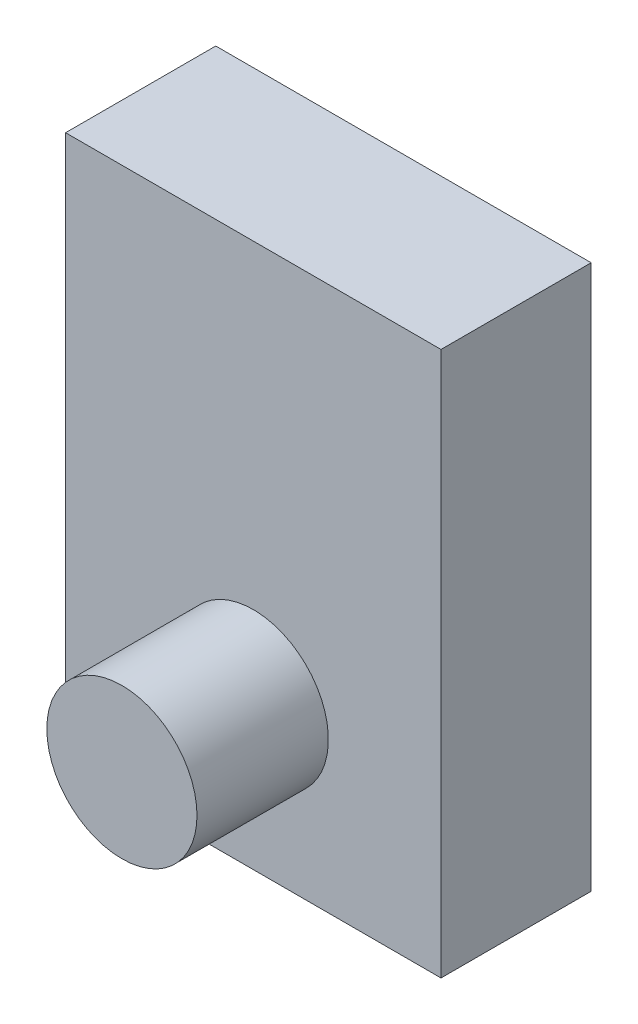
ISO-10303-21;
HEADER;
FILE_DESCRIPTION(('STEP AP214'),'2;1');
FILE_NAME('part.step','',(''),(''),'','','');
FILE_SCHEMA(('AUTOMOTIVE_DESIGN { 1 0 10303 214 1 1 1 1 }'));
ENDSEC;
DATA;
#1=APPLICATION_CONTEXT('core data for automotive mechanical design processes');
#2=APPLICATION_PROTOCOL_DEFINITION('international standard','automotive_design',2000,#1);
#3=PRODUCT_CONTEXT('',#1,'mechanical');
#4=PRODUCT('Part','Part','',(#3));
#5=PRODUCT_RELATED_PRODUCT_CATEGORY('part','',(#4));
#6=PRODUCT_DEFINITION_FORMATION('','',#4);
#7=PRODUCT_DEFINITION_CONTEXT('part definition',#1,'design');
#8=PRODUCT_DEFINITION('design','',#6,#7);
#9=PRODUCT_DEFINITION_SHAPE('','',#8);
#10=(LENGTH_UNIT() NAMED_UNIT(*) SI_UNIT(.MILLI.,.METRE.));
#11=(NAMED_UNIT(*) PLANE_ANGLE_UNIT() SI_UNIT($,.RADIAN.));
#12=(NAMED_UNIT(*) SI_UNIT($,.STERADIAN.) SOLID_ANGLE_UNIT());
#13=UNCERTAINTY_MEASURE_WITH_UNIT(LENGTH_MEASURE(1.E-05),#10,'distance_accuracy_value','');
#14=(GEOMETRIC_REPRESENTATION_CONTEXT(3) GLOBAL_UNCERTAINTY_ASSIGNED_CONTEXT((#13)) GLOBAL_UNIT_ASSIGNED_CONTEXT((#10,
#11,#12)) REPRESENTATION_CONTEXT('',''));
#15=CARTESIAN_POINT('',(0.,0.,0.));
#16=DIRECTION('',(0.,0.,1.));
#17=DIRECTION('',(1.,0.,0.));
#18=AXIS2_PLACEMENT_3D('',#15,#16,#17);
#19=CARTESIAN_POINT('',(-10.,29.,-6.5));
#20=DIRECTION('',(1.,0.,0.));
#21=DIRECTION('',(0.,0.,-1.));
#22=AXIS2_PLACEMENT_3D('',#19,#20,#21);
#23=PLANE('',#22);
#24=DIRECTION('',(0.,0.,1.));
#25=VECTOR('',#24,1.);
#26=CARTESIAN_POINT('',(-10.,0.,-6.5));
#27=LINE('',#26,#25);
#28=CARTESIAN_POINT('',(-10.,0.,-6.5));
#29=VERTEX_POINT('',#28);
#30=CARTESIAN_POINT('',(-10.,0.,1.5));
#31=VERTEX_POINT('',#30);
#32=EDGE_CURVE('E112',#29,#31,#27,.T.);
#33=ORIENTED_EDGE('',*,*,#32,.T.);
#34=DIRECTION('',(0.,-1.,0.));
#35=VECTOR('',#34,1.);
#36=CARTESIAN_POINT('',(-10.,29.,1.5));
#37=LINE('',#36,#35);
#38=CARTESIAN_POINT('',(-10.,29.,1.5));
#39=VERTEX_POINT('',#38);
#40=EDGE_CURVE('E105',#39,#31,#37,.T.);
#41=ORIENTED_EDGE('',*,*,#40,.F.);
#42=DIRECTION('',(0.,0.,1.));
#43=VECTOR('',#42,1.);
#44=CARTESIAN_POINT('',(-10.,29.,-6.5));
#45=LINE('',#44,#43);
#46=CARTESIAN_POINT('',(-10.,29.,-6.5));
#47=VERTEX_POINT('',#46);
#48=EDGE_CURVE('E96',#47,#39,#45,.T.);
#49=ORIENTED_EDGE('',*,*,#48,.F.);
#50=DIRECTION('',(0.,-1.,0.));
#51=VECTOR('',#50,1.);
#52=CARTESIAN_POINT('',(-10.,29.,-6.5));
#53=LINE('',#52,#51);
#54=EDGE_CURVE('E110',#47,#29,#53,.T.);
#55=ORIENTED_EDGE('',*,*,#54,.T.);
#56=EDGE_LOOP('',(#33,#41,#49,#55));
#57=FACE_BOUND('',#56,.T.);
#58=ADVANCED_FACE('F43',(#57),#23,.F.);
#59=CARTESIAN_POINT('',(-10.,29.,1.5));
#60=DIRECTION('',(0.,0.,-1.));
#61=DIRECTION('',(-1.,0.,0.));
#62=AXIS2_PLACEMENT_3D('',#59,#60,#61);
#63=PLANE('',#62);
#64=CARTESIAN_POINT('',(0.,8.,1.5));
#65=DIRECTION('',(0.,0.,-1.));
#66=DIRECTION('',(-1.,0.,0.));
#67=AXIS2_PLACEMENT_3D('',#64,#65,#66);
#68=CIRCLE('',#67,4.);
#69=CARTESIAN_POINT('',(-4.,8.,1.5));
#70=VERTEX_POINT('',#69);
#71=EDGE_CURVE('E11',#70,#70,#68,.F.);
#72=ORIENTED_EDGE('',*,*,#71,.F.);
#73=EDGE_LOOP('',(#72));
#74=FACE_BOUND('',#73,.T.);
#75=DIRECTION('',(1.,0.,0.));
#76=VECTOR('',#75,1.);
#77=CARTESIAN_POINT('',(-10.,0.,1.5));
#78=LINE('',#77,#76);
#79=CARTESIAN_POINT('',(10.,0.,1.5));
#80=VERTEX_POINT('',#79);
#81=EDGE_CURVE('E101',#31,#80,#78,.T.);
#82=ORIENTED_EDGE('',*,*,#81,.T.);
#83=DIRECTION('',(0.,-1.,0.));
#84=VECTOR('',#83,1.);
#85=CARTESIAN_POINT('',(10.,29.,1.5));
#86=LINE('',#85,#84);
#87=CARTESIAN_POINT('',(10.,29.,1.5));
#88=VERTEX_POINT('',#87);
#89=EDGE_CURVE('E97',#88,#80,#86,.T.);
#90=ORIENTED_EDGE('',*,*,#89,.F.);
#91=DIRECTION('',(1.,0.,0.));
#92=VECTOR('',#91,1.);
#93=CARTESIAN_POINT('',(-10.,29.,1.5));
#94=LINE('',#93,#92);
#95=EDGE_CURVE('E93',#39,#88,#94,.T.);
#96=ORIENTED_EDGE('',*,*,#95,.F.);
#97=ORIENTED_EDGE('',*,*,#40,.T.);
#98=EDGE_LOOP('',(#82,#90,#96,#97));
#99=FACE_BOUND('',#98,.T.);
#100=ADVANCED_FACE('F99',(#74,#99),#63,.F.);
#101=CARTESIAN_POINT('',(10.,29.,1.5));
#102=DIRECTION('',(-1.,0.,0.));
#103=DIRECTION('',(0.,0.,1.));
#104=AXIS2_PLACEMENT_3D('',#101,#102,#103);
#105=PLANE('',#104);
#106=DIRECTION('',(0.,0.,-1.));
#107=VECTOR('',#106,1.);
#108=CARTESIAN_POINT('',(10.,0.,1.5));
#109=LINE('',#108,#107);
#110=CARTESIAN_POINT('',(10.,0.,-6.5));
#111=VERTEX_POINT('',#110);
#112=EDGE_CURVE('E80',#80,#111,#109,.T.);
#113=ORIENTED_EDGE('',*,*,#112,.T.);
#114=DIRECTION('',(0.,-1.,0.));
#115=VECTOR('',#114,1.);
#116=CARTESIAN_POINT('',(10.,29.,-6.5));
#117=LINE('',#116,#115);
#118=CARTESIAN_POINT('',(10.,29.,-6.5));
#119=VERTEX_POINT('',#118);
#120=EDGE_CURVE('E103',#119,#111,#117,.T.);
#121=ORIENTED_EDGE('',*,*,#120,.F.);
#122=DIRECTION('',(0.,0.,-1.));
#123=VECTOR('',#122,1.);
#124=CARTESIAN_POINT('',(10.,29.,1.5));
#125=LINE('',#124,#123);
#126=EDGE_CURVE('E94',#88,#119,#125,.T.);
#127=ORIENTED_EDGE('',*,*,#126,.F.);
#128=ORIENTED_EDGE('',*,*,#89,.T.);
#129=EDGE_LOOP('',(#113,#121,#127,#128));
#130=FACE_BOUND('',#129,.T.);
#131=ADVANCED_FACE('F104',(#130),#105,.F.);
#132=CARTESIAN_POINT('',(10.,29.,-6.5));
#133=DIRECTION('',(0.,0.,1.));
#134=DIRECTION('',(1.,0.,0.));
#135=AXIS2_PLACEMENT_3D('',#132,#133,#134);
#136=PLANE('',#135);
#137=CARTESIAN_POINT('',(0.,8.,-6.5));
#138=DIRECTION('',(0.,0.,1.));
#139=DIRECTION('',(1.,0.,0.));
#140=AXIS2_PLACEMENT_3D('',#137,#138,#139);
#141=CIRCLE('',#140,4.);
#142=CARTESIAN_POINT('',(4.,8.,-6.5));
#143=VERTEX_POINT('',#142);
#144=EDGE_CURVE('E46',#143,#143,#141,.F.);
#145=ORIENTED_EDGE('',*,*,#144,.F.);
#146=EDGE_LOOP('',(#145));
#147=FACE_BOUND('',#146,.T.);
#148=DIRECTION('',(-1.,0.,0.));
#149=VECTOR('',#148,1.);
#150=CARTESIAN_POINT('',(10.,0.,-6.5));
#151=LINE('',#150,#149);
#152=EDGE_CURVE('E82',#111,#29,#151,.T.);
#153=ORIENTED_EDGE('',*,*,#152,.T.);
#154=ORIENTED_EDGE('',*,*,#54,.F.);
#155=DIRECTION('',(-1.,0.,0.));
#156=VECTOR('',#155,1.);
#157=CARTESIAN_POINT('',(10.,29.,-6.5));
#158=LINE('',#157,#156);
#159=EDGE_CURVE('E58',#119,#47,#158,.T.);
#160=ORIENTED_EDGE('',*,*,#159,.F.);
#161=ORIENTED_EDGE('',*,*,#120,.T.);
#162=EDGE_LOOP('',(#153,#154,#160,#161));
#163=FACE_BOUND('',#162,.T.);
#164=ADVANCED_FACE('F123',(#147,#163),#136,.F.);
#165=CARTESIAN_POINT('',(0.,29.,0.));
#166=DIRECTION('',(0.,1.,0.));
#167=DIRECTION('',(0.,0.,1.));
#168=AXIS2_PLACEMENT_3D('',#165,#166,#167);
#169=PLANE('',#168);
#170=ORIENTED_EDGE('',*,*,#48,.T.);
#171=ORIENTED_EDGE('',*,*,#95,.T.);
#172=ORIENTED_EDGE('',*,*,#126,.T.);
#173=ORIENTED_EDGE('',*,*,#159,.T.);
#174=EDGE_LOOP('',(#170,#171,#172,#173));
#175=FACE_BOUND('',#174,.T.);
#176=ADVANCED_FACE('F95',(#175),#169,.T.);
#177=CARTESIAN_POINT('',(0.,0.,0.));
#178=DIRECTION('',(0.,1.,0.));
#179=DIRECTION('',(0.,0.,1.));
#180=AXIS2_PLACEMENT_3D('',#177,#178,#179);
#181=PLANE('',#180);
#182=ORIENTED_EDGE('',*,*,#32,.F.);
#183=ORIENTED_EDGE('',*,*,#152,.F.);
#184=ORIENTED_EDGE('',*,*,#112,.F.);
#185=ORIENTED_EDGE('',*,*,#81,.F.);
#186=EDGE_LOOP('',(#182,#183,#184,#185));
#187=FACE_BOUND('',#186,.T.);
#188=ADVANCED_FACE('F132',(#187),#181,.F.);
#189=CARTESIAN_POINT('',(0.,8.,-8.5));
#190=DIRECTION('',(0.,0.,1.));
#191=DIRECTION('',(1.,0.,0.));
#192=AXIS2_PLACEMENT_3D('',#189,#190,#191);
#193=PLANE('',#192);
#194=CARTESIAN_POINT('',(0.,8.,-8.5));
#195=DIRECTION('',(0.,0.,1.));
#196=DIRECTION('',(1.,0.,0.));
#197=AXIS2_PLACEMENT_3D('',#194,#195,#196);
#198=CIRCLE('',#197,4.);
#199=CARTESIAN_POINT('',(4.,8.,-8.5));
#200=VERTEX_POINT('',#199);
#201=EDGE_CURVE('E165',#200,#200,#198,.T.);
#202=ORIENTED_EDGE('',*,*,#201,.F.);
#203=EDGE_LOOP('',(#202));
#204=FACE_BOUND('',#203,.T.);
#205=ADVANCED_FACE('F145',(#204),#193,.F.);
#206=CARTESIAN_POINT('',(0.,8.,8.5));
#207=DIRECTION('',(0.,0.,-1.));
#208=DIRECTION('',(-1.,0.,0.));
#209=AXIS2_PLACEMENT_3D('',#206,#207,#208);
#210=CYLINDRICAL_SURFACE('',#209,4.);
#211=ORIENTED_EDGE('',*,*,#201,.T.);
#212=EDGE_LOOP('',(#211));
#213=FACE_BOUND('',#212,.T.);
#214=ORIENTED_EDGE('',*,*,#144,.T.);
#215=EDGE_LOOP('',(#214));
#216=FACE_BOUND('',#215,.T.);
#217=ADVANCED_FACE('F125',(#213,#216),#210,.T.);
#218=CARTESIAN_POINT('',(0.,8.,8.5));
#219=DIRECTION('',(0.,0.,1.));
#220=DIRECTION('',(1.,0.,0.));
#221=AXIS2_PLACEMENT_3D('',#218,#219,#220);
#222=CIRCLE('',#221,4.);
#223=CARTESIAN_POINT('',(4.,8.,8.5));
#224=VERTEX_POINT('',#223);
#225=EDGE_CURVE('E111',#224,#224,#222,.T.);
#226=ORIENTED_EDGE('',*,*,#225,.F.);
#227=EDGE_LOOP('',(#226));
#228=FACE_BOUND('',#227,.T.);
#229=ORIENTED_EDGE('',*,*,#71,.T.);
#230=EDGE_LOOP('',(#229));
#231=FACE_BOUND('',#230,.T.);
#232=ADVANCED_FACE('F151',(#228,#231),#210,.T.);
#233=CARTESIAN_POINT('',(0.,8.,8.5));
#234=DIRECTION('',(0.,0.,1.));
#235=DIRECTION('',(1.,0.,0.));
#236=AXIS2_PLACEMENT_3D('',#233,#234,#235);
#237=PLANE('',#236);
#238=ORIENTED_EDGE('',*,*,#225,.T.);
#239=EDGE_LOOP('',(#238));
#240=FACE_BOUND('',#239,.T.);
#241=ADVANCED_FACE('F153',(#240),#237,.T.);
#242=CLOSED_SHELL('',(#58,#100,#131,#164,#176,#188,#205,#217,#232,#241));
#243=MANIFOLD_SOLID_BREP('B2',#242);
#244=ADVANCED_BREP_SHAPE_REPRESENTATION('',(#18,#243),#14);
#245=SHAPE_DEFINITION_REPRESENTATION(#9,#244);
ENDSEC;
END-ISO-10303-21;
